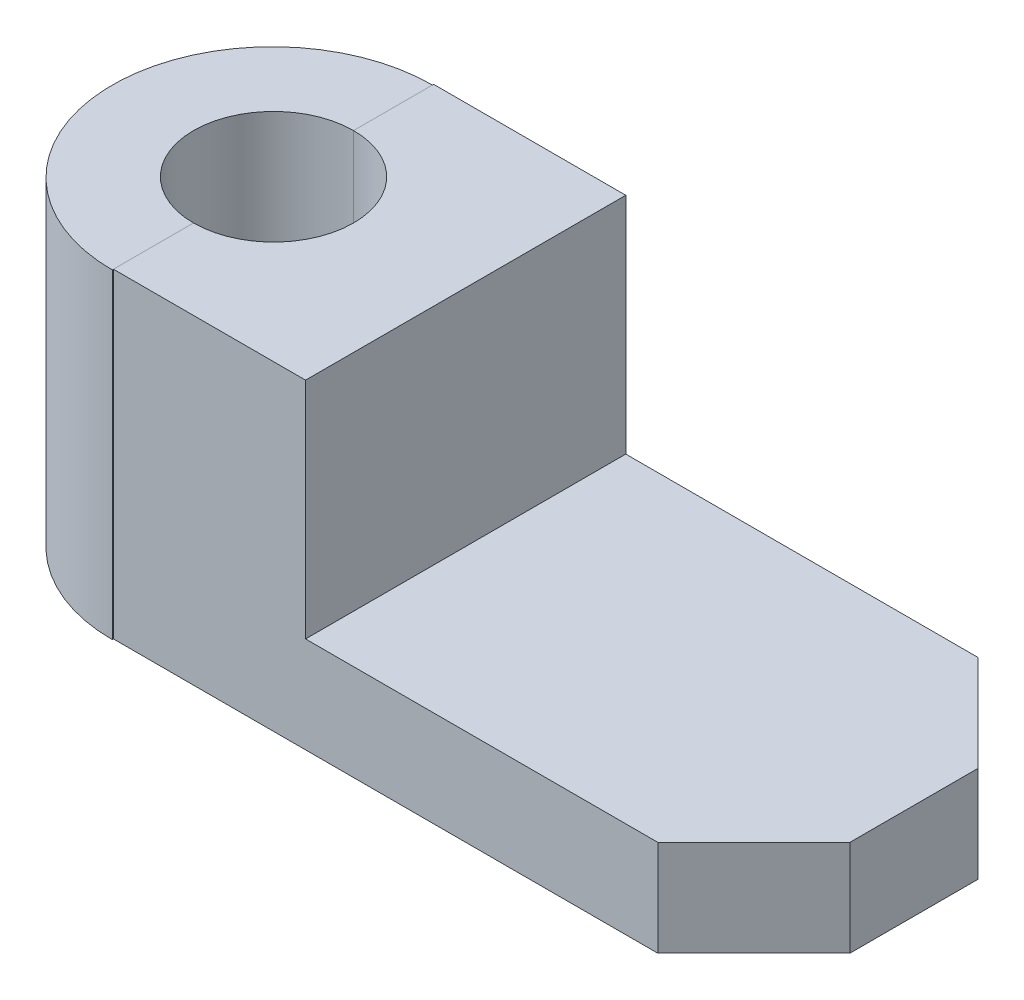
ISO-10303-21;
HEADER;
FILE_DESCRIPTION(('STEP AP214'),'2;1');
FILE_NAME('part.step','',(''),(''),'','','');
FILE_SCHEMA(('AUTOMOTIVE_DESIGN { 1 0 10303 214 1 1 1 1 }'));
ENDSEC;
DATA;
#1=APPLICATION_CONTEXT('core data for automotive mechanical design processes');
#2=APPLICATION_PROTOCOL_DEFINITION('international standard','automotive_design',2000,#1);
#3=PRODUCT_CONTEXT('',#1,'mechanical');
#4=PRODUCT('Part','Part','',(#3));
#5=PRODUCT_RELATED_PRODUCT_CATEGORY('part','',(#4));
#6=PRODUCT_DEFINITION_FORMATION('','',#4);
#7=PRODUCT_DEFINITION_CONTEXT('part definition',#1,'design');
#8=PRODUCT_DEFINITION('design','',#6,#7);
#9=PRODUCT_DEFINITION_SHAPE('','',#8);
#10=(LENGTH_UNIT() NAMED_UNIT(*) SI_UNIT(.MILLI.,.METRE.));
#11=(NAMED_UNIT(*) PLANE_ANGLE_UNIT() SI_UNIT($,.RADIAN.));
#12=(NAMED_UNIT(*) SI_UNIT($,.STERADIAN.) SOLID_ANGLE_UNIT());
#13=UNCERTAINTY_MEASURE_WITH_UNIT(LENGTH_MEASURE(1.E-05),#10,'distance_accuracy_value','');
#14=(GEOMETRIC_REPRESENTATION_CONTEXT(3) GLOBAL_UNCERTAINTY_ASSIGNED_CONTEXT((#13)) GLOBAL_UNIT_ASSIGNED_CONTEXT((#10,
#11,#12)) REPRESENTATION_CONTEXT('',''));
#15=CARTESIAN_POINT('',(0.,0.,0.));
#16=DIRECTION('',(0.,0.,1.));
#17=DIRECTION('',(1.,0.,0.));
#18=AXIS2_PLACEMENT_3D('',#15,#16,#17);
#19=CARTESIAN_POINT('',(-18.,0.,-14.8899054333838));
#20=DIRECTION('',(1.,0.,0.));
#21=DIRECTION('',(0.,0.,-1.));
#22=AXIS2_PLACEMENT_3D('',#19,#20,#21);
#23=PLANE('',#22);
#24=DIRECTION('',(0.,1.,0.));
#25=VECTOR('',#24,1.);
#26=CARTESIAN_POINT('',(-18.,0.,-7.5));
#27=LINE('',#26,#25);
#28=CARTESIAN_POINT('',(-18.,0.,-7.5));
#29=VERTEX_POINT('',#28);
#30=CARTESIAN_POINT('',(-18.,30.,-7.5));
#31=VERTEX_POINT('',#30);
#32=EDGE_CURVE('E71',#29,#31,#27,.T.);
#33=ORIENTED_EDGE('',*,*,#32,.F.);
#34=DIRECTION('',(0.,0.,-1.));
#35=VECTOR('',#34,1.);
#36=CARTESIAN_POINT('',(-18.,0.,-14.8899054333838));
#37=LINE('',#36,#35);
#38=CARTESIAN_POINT('',(-18.,0.,-14.8899054333838));
#39=VERTEX_POINT('',#38);
#40=EDGE_CURVE('E79',#29,#39,#37,.T.);
#41=ORIENTED_EDGE('',*,*,#40,.T.);
#42=DIRECTION('',(0.,1.,0.));
#43=VECTOR('',#42,1.);
#44=CARTESIAN_POINT('',(-18.,0.,-14.8899054333838));
#45=LINE('',#44,#43);
#46=CARTESIAN_POINT('',(-18.,30.,-14.8899054333838));
#47=VERTEX_POINT('',#46);
#48=EDGE_CURVE('E65',#39,#47,#45,.T.);
#49=ORIENTED_EDGE('',*,*,#48,.T.);
#50=DIRECTION('',(0.,0.,-1.));
#51=VECTOR('',#50,1.);
#52=CARTESIAN_POINT('',(-18.,30.,-14.8899054333838));
#53=LINE('',#52,#51);
#54=EDGE_CURVE('E93',#31,#47,#53,.T.);
#55=ORIENTED_EDGE('',*,*,#54,.F.);
#56=EDGE_LOOP('',(#33,#41,#49,#55));
#57=FACE_BOUND('',#56,.T.);
#58=ADVANCED_FACE('F57',(#57),#23,.T.);
#59=CARTESIAN_POINT('',(-18.,0.,0.110094566616196));
#60=DIRECTION('',(0.,1.,0.));
#61=DIRECTION('',(0.,0.,1.));
#62=AXIS2_PLACEMENT_3D('',#59,#60,#61);
#63=CYLINDRICAL_SURFACE('',#62,15.);
#64=CARTESIAN_POINT('',(-18.,30.,0.110094566616196));
#65=DIRECTION('',(0.,1.,0.));
#66=DIRECTION('',(0.,0.,1.));
#67=AXIS2_PLACEMENT_3D('',#64,#65,#66);
#68=CIRCLE('',#67,15.);
#69=CARTESIAN_POINT('',(-18.,30.,15.1100945666162));
#70=VERTEX_POINT('',#69);
#71=EDGE_CURVE('E97',#47,#70,#68,.T.);
#72=ORIENTED_EDGE('',*,*,#71,.F.);
#73=ORIENTED_EDGE('',*,*,#48,.F.);
#74=CARTESIAN_POINT('',(-18.,0.,0.110094566616196));
#75=DIRECTION('',(0.,1.,0.));
#76=DIRECTION('',(0.,0.,1.));
#77=AXIS2_PLACEMENT_3D('',#74,#75,#76);
#78=CIRCLE('',#77,15.);
#79=CARTESIAN_POINT('',(-18.,0.,15.1100945666162));
#80=VERTEX_POINT('',#79);
#81=EDGE_CURVE('E112',#39,#80,#78,.T.);
#82=ORIENTED_EDGE('',*,*,#81,.T.);
#83=DIRECTION('',(0.,1.,0.));
#84=VECTOR('',#83,1.);
#85=CARTESIAN_POINT('',(-18.,0.,15.1100945666162));
#86=LINE('',#85,#84);
#87=EDGE_CURVE('E104',#80,#70,#86,.T.);
#88=ORIENTED_EDGE('',*,*,#87,.T.);
#89=EDGE_LOOP('',(#72,#73,#82,#88));
#90=FACE_BOUND('',#89,.T.);
#91=ADVANCED_FACE('F59',(#90),#63,.T.);
#92=DIRECTION('',(0.,1.,0.));
#93=VECTOR('',#92,1.);
#94=CARTESIAN_POINT('',(-18.,0.,7.5));
#95=LINE('',#94,#93);
#96=CARTESIAN_POINT('',(-18.,30.,7.5));
#97=VERTEX_POINT('',#96);
#98=CARTESIAN_POINT('',(-18.,0.,7.5));
#99=VERTEX_POINT('',#98);
#100=EDGE_CURVE('E107',#97,#99,#95,.F.);
#101=ORIENTED_EDGE('',*,*,#100,.F.);
#102=EDGE_CURVE('E99',#70,#97,#53,.T.);
#103=ORIENTED_EDGE('',*,*,#102,.F.);
#104=ORIENTED_EDGE('',*,*,#87,.F.);
#105=EDGE_CURVE('E110',#80,#99,#37,.T.);
#106=ORIENTED_EDGE('',*,*,#105,.T.);
#107=EDGE_LOOP('',(#101,#103,#104,#106));
#108=FACE_BOUND('',#107,.T.);
#109=ADVANCED_FACE('F129',(#108),#23,.T.);
#110=CARTESIAN_POINT('',(-18.,0.,0.110094566616196));
#111=DIRECTION('',(0.,1.,0.));
#112=DIRECTION('',(0.,0.,1.));
#113=AXIS2_PLACEMENT_3D('',#110,#111,#112);
#114=PLANE('',#113);
#115=ORIENTED_EDGE('',*,*,#40,.F.);
#116=CARTESIAN_POINT('',(-18.,0.,0.));
#117=DIRECTION('',(0.,1.,0.));
#118=DIRECTION('',(0.,0.,1.));
#119=AXIS2_PLACEMENT_3D('',#116,#117,#118);
#120=CIRCLE('',#119,7.5);
#121=EDGE_CURVE('E121',#29,#99,#120,.T.);
#122=ORIENTED_EDGE('',*,*,#121,.T.);
#123=ORIENTED_EDGE('',*,*,#105,.F.);
#124=ORIENTED_EDGE('',*,*,#81,.F.);
#125=EDGE_LOOP('',(#115,#122,#123,#124));
#126=FACE_BOUND('',#125,.T.);
#127=ADVANCED_FACE('F124',(#126),#114,.F.);
#128=CARTESIAN_POINT('',(-18.,30.,0.110094566616196));
#129=DIRECTION('',(0.,1.,0.));
#130=DIRECTION('',(0.,0.,1.));
#131=AXIS2_PLACEMENT_3D('',#128,#129,#130);
#132=PLANE('',#131);
#133=CARTESIAN_POINT('',(-18.,30.,0.));
#134=DIRECTION('',(0.,1.,0.));
#135=DIRECTION('',(0.,0.,1.));
#136=AXIS2_PLACEMENT_3D('',#133,#134,#135);
#137=CIRCLE('',#136,7.5);
#138=EDGE_CURVE('E12',#31,#97,#137,.T.);
#139=ORIENTED_EDGE('',*,*,#138,.F.);
#140=ORIENTED_EDGE('',*,*,#54,.T.);
#141=ORIENTED_EDGE('',*,*,#71,.T.);
#142=ORIENTED_EDGE('',*,*,#102,.T.);
#143=EDGE_LOOP('',(#139,#140,#141,#142));
#144=FACE_BOUND('',#143,.T.);
#145=ADVANCED_FACE('F94',(#144),#132,.T.);
#146=CARTESIAN_POINT('',(-18.,0.,0.));
#147=DIRECTION('',(0.,1.,0.));
#148=DIRECTION('',(0.,0.,1.));
#149=AXIS2_PLACEMENT_3D('',#146,#147,#148);
#150=CYLINDRICAL_SURFACE('',#149,7.5);
#151=ORIENTED_EDGE('',*,*,#32,.T.);
#152=ORIENTED_EDGE('',*,*,#138,.T.);
#153=ORIENTED_EDGE('',*,*,#100,.T.);
#154=ORIENTED_EDGE('',*,*,#121,.F.);
#155=EDGE_LOOP('',(#151,#152,#153,#154));
#156=FACE_BOUND('',#155,.T.);
#157=ADVANCED_FACE('F127',(#156),#150,.F.);
#158=CLOSED_SHELL('',(#58,#91,#109,#127,#145,#157));
#159=MANIFOLD_SOLID_BREP('B2',#158);
#160=CARTESIAN_POINT('',(-18.,0.,15.));
#161=DIRECTION('',(1.,0.,0.));
#162=DIRECTION('',(0.,1.,0.));
#163=AXIS2_PLACEMENT_3D('',#160,#161,#162);
#164=PLANE('',#163);
#165=DIRECTION('',(0.,0.,-1.));
#166=VECTOR('',#165,1.);
#167=CARTESIAN_POINT('',(-18.,0.,15.));
#168=LINE('',#167,#166);
#169=CARTESIAN_POINT('',(-18.,0.,-7.5));
#170=VERTEX_POINT('',#169);
#171=CARTESIAN_POINT('',(-18.,0.,-15.));
#172=VERTEX_POINT('',#171);
#173=EDGE_CURVE('E281',#170,#172,#168,.T.);
#174=ORIENTED_EDGE('',*,*,#173,.F.);
#175=DIRECTION('',(0.,1.,0.));
#176=VECTOR('',#175,1.);
#177=CARTESIAN_POINT('',(-18.,0.,-7.5));
#178=LINE('',#177,#176);
#179=CARTESIAN_POINT('',(-18.,30.,-7.5));
#180=VERTEX_POINT('',#179);
#181=EDGE_CURVE('E258',#170,#180,#178,.T.);
#182=ORIENTED_EDGE('',*,*,#181,.T.);
#183=DIRECTION('',(0.,0.,-1.));
#184=VECTOR('',#183,1.);
#185=CARTESIAN_POINT('',(-18.,30.,15.));
#186=LINE('',#185,#184);
#187=CARTESIAN_POINT('',(-18.,30.,-15.));
#188=VERTEX_POINT('',#187);
#189=EDGE_CURVE('E343',#180,#188,#186,.T.);
#190=ORIENTED_EDGE('',*,*,#189,.T.);
#191=DIRECTION('',(0.,-1.,0.));
#192=VECTOR('',#191,1.);
#193=CARTESIAN_POINT('',(-18.,0.,-15.));
#194=LINE('',#193,#192);
#195=EDGE_CURVE('E366',#188,#172,#194,.T.);
#196=ORIENTED_EDGE('',*,*,#195,.T.);
#197=EDGE_LOOP('',(#174,#182,#190,#196));
#198=FACE_BOUND('',#197,.T.);
#199=ADVANCED_FACE('F178',(#198),#164,.F.);
#200=CARTESIAN_POINT('',(-18.,30.,15.));
#201=VERTEX_POINT('',#200);
#202=CARTESIAN_POINT('',(-18.,30.,7.5));
#203=VERTEX_POINT('',#202);
#204=EDGE_CURVE('E272',#201,#203,#186,.T.);
#205=ORIENTED_EDGE('',*,*,#204,.T.);
#206=DIRECTION('',(0.,1.,0.));
#207=VECTOR('',#206,1.);
#208=CARTESIAN_POINT('',(-18.,0.,7.5));
#209=LINE('',#208,#207);
#210=CARTESIAN_POINT('',(-18.,0.,7.5));
#211=VERTEX_POINT('',#210);
#212=EDGE_CURVE('E195',#203,#211,#209,.F.);
#213=ORIENTED_EDGE('',*,*,#212,.T.);
#214=CARTESIAN_POINT('',(-18.,0.,15.));
#215=VERTEX_POINT('',#214);
#216=EDGE_CURVE('E270',#215,#211,#168,.T.);
#217=ORIENTED_EDGE('',*,*,#216,.F.);
#218=DIRECTION('',(0.,-1.,0.));
#219=VECTOR('',#218,1.);
#220=CARTESIAN_POINT('',(-18.,0.,15.));
#221=LINE('',#220,#219);
#222=EDGE_CURVE('E355',#201,#215,#221,.T.);
#223=ORIENTED_EDGE('',*,*,#222,.F.);
#224=EDGE_LOOP('',(#205,#213,#217,#223));
#225=FACE_BOUND('',#224,.T.);
#226=ADVANCED_FACE('F268',(#225),#164,.F.);
#227=CARTESIAN_POINT('',(42.,0.,15.));
#228=DIRECTION('',(0.,1.,0.));
#229=DIRECTION('',(-1.,0.,0.));
#230=AXIS2_PLACEMENT_3D('',#227,#228,#229);
#231=PLANE('',#230);
#232=ORIENTED_EDGE('',*,*,#216,.T.);
#233=CARTESIAN_POINT('',(-18.,0.,0.));
#234=DIRECTION('',(0.,1.,0.));
#235=DIRECTION('',(0.,0.,1.));
#236=AXIS2_PLACEMENT_3D('',#233,#234,#235);
#237=CIRCLE('',#236,7.5);
#238=EDGE_CURVE('E255',#211,#170,#237,.T.);
#239=ORIENTED_EDGE('',*,*,#238,.T.);
#240=ORIENTED_EDGE('',*,*,#173,.T.);
#241=DIRECTION('',(1.,0.,0.));
#242=VECTOR('',#241,1.);
#243=CARTESIAN_POINT('',(0.,0.,-15.));
#244=LINE('',#243,#242);
#245=CARTESIAN_POINT('',(33.,0.,-15.));
#246=VERTEX_POINT('',#245);
#247=EDGE_CURVE('E323',#172,#246,#244,.T.);
#248=ORIENTED_EDGE('',*,*,#247,.T.);
#249=DIRECTION('',(0.707106781186549,0.,0.707106781186546));
#250=VECTOR('',#249,1.);
#251=CARTESIAN_POINT('',(42.,0.,-6.));
#252=LINE('',#251,#250);
#253=CARTESIAN_POINT('',(42.,0.,-6.));
#254=VERTEX_POINT('',#253);
#255=EDGE_CURVE('E55',#246,#254,#252,.T.);
#256=ORIENTED_EDGE('',*,*,#255,.T.);
#257=DIRECTION('',(0.,0.,-1.));
#258=VECTOR('',#257,1.);
#259=CARTESIAN_POINT('',(42.,0.,15.));
#260=LINE('',#259,#258);
#261=CARTESIAN_POINT('',(42.,0.,5.99999999999997));
#262=VERTEX_POINT('',#261);
#263=EDGE_CURVE('E288',#262,#254,#260,.T.);
#264=ORIENTED_EDGE('',*,*,#263,.F.);
#265=DIRECTION('',(0.707106781186546,0.,-0.707106781186549));
#266=VECTOR('',#265,1.);
#267=CARTESIAN_POINT('',(33.,0.,15.));
#268=LINE('',#267,#266);
#269=CARTESIAN_POINT('',(33.,0.,15.));
#270=VERTEX_POINT('',#269);
#271=EDGE_CURVE('E297',#262,#270,#268,.F.);
#272=ORIENTED_EDGE('',*,*,#271,.T.);
#273=DIRECTION('',(1.,0.,0.));
#274=VECTOR('',#273,1.);
#275=CARTESIAN_POINT('',(0.,0.,15.));
#276=LINE('',#275,#274);
#277=EDGE_CURVE('E277',#215,#270,#276,.T.);
#278=ORIENTED_EDGE('',*,*,#277,.F.);
#279=EDGE_LOOP('',(#232,#239,#240,#248,#256,#264,#272,#278));
#280=FACE_BOUND('',#279,.T.);
#281=ADVANCED_FACE('F275',(#280),#231,.F.);
#282=CARTESIAN_POINT('',(42.,9.,15.));
#283=DIRECTION('',(-1.,0.,0.));
#284=DIRECTION('',(0.,0.,1.));
#285=AXIS2_PLACEMENT_3D('',#282,#283,#284);
#286=PLANE('',#285);
#287=ORIENTED_EDGE('',*,*,#263,.T.);
#288=DIRECTION('',(0.,1.,0.));
#289=VECTOR('',#288,1.);
#290=CARTESIAN_POINT('',(42.,9.,-6.));
#291=LINE('',#290,#289);
#292=CARTESIAN_POINT('',(42.,9.,-6.));
#293=VERTEX_POINT('',#292);
#294=EDGE_CURVE('E300',#254,#293,#291,.T.);
#295=ORIENTED_EDGE('',*,*,#294,.T.);
#296=DIRECTION('',(0.,0.,-1.));
#297=VECTOR('',#296,1.);
#298=CARTESIAN_POINT('',(42.,9.,15.));
#299=LINE('',#298,#297);
#300=CARTESIAN_POINT('',(42.,9.,5.99999999999997));
#301=VERTEX_POINT('',#300);
#302=EDGE_CURVE('E314',#301,#293,#299,.T.);
#303=ORIENTED_EDGE('',*,*,#302,.F.);
#304=DIRECTION('',(0.,-1.,0.));
#305=VECTOR('',#304,1.);
#306=CARTESIAN_POINT('',(42.,9.,5.99999999999997));
#307=LINE('',#306,#305);
#308=EDGE_CURVE('E294',#301,#262,#307,.T.);
#309=ORIENTED_EDGE('',*,*,#308,.T.);
#310=EDGE_LOOP('',(#287,#295,#303,#309));
#311=FACE_BOUND('',#310,.T.);
#312=ADVANCED_FACE('F330',(#311),#286,.F.);
#313=CARTESIAN_POINT('',(0.,9.,15.));
#314=DIRECTION('',(0.,-1.,0.));
#315=DIRECTION('',(0.,0.,-1.));
#316=AXIS2_PLACEMENT_3D('',#313,#314,#315);
#317=PLANE('',#316);
#318=ORIENTED_EDGE('',*,*,#302,.T.);
#319=DIRECTION('',(-0.707106781186549,0.,-0.707106781186546));
#320=VECTOR('',#319,1.);
#321=CARTESIAN_POINT('',(42.,9.,-6.));
#322=LINE('',#321,#320);
#323=CARTESIAN_POINT('',(33.,9.,-15.));
#324=VERTEX_POINT('',#323);
#325=EDGE_CURVE('E304',#293,#324,#322,.T.);
#326=ORIENTED_EDGE('',*,*,#325,.T.);
#327=DIRECTION('',(-1.,0.,0.));
#328=VECTOR('',#327,1.);
#329=CARTESIAN_POINT('',(0.,9.,-15.));
#330=LINE('',#329,#328);
#331=CARTESIAN_POINT('',(0.,9.,-15.));
#332=VERTEX_POINT('',#331);
#333=EDGE_CURVE('E311',#324,#332,#330,.T.);
#334=ORIENTED_EDGE('',*,*,#333,.T.);
#335=DIRECTION('',(0.,0.,-1.));
#336=VECTOR('',#335,1.);
#337=CARTESIAN_POINT('',(0.,9.,15.));
#338=LINE('',#337,#336);
#339=CARTESIAN_POINT('',(0.,9.,15.));
#340=VERTEX_POINT('',#339);
#341=EDGE_CURVE('E334',#340,#332,#338,.T.);
#342=ORIENTED_EDGE('',*,*,#341,.F.);
#343=DIRECTION('',(-1.,0.,0.));
#344=VECTOR('',#343,1.);
#345=CARTESIAN_POINT('',(0.,9.,15.));
#346=LINE('',#345,#344);
#347=CARTESIAN_POINT('',(33.,9.,15.));
#348=VERTEX_POINT('',#347);
#349=EDGE_CURVE('E350',#348,#340,#346,.T.);
#350=ORIENTED_EDGE('',*,*,#349,.F.);
#351=DIRECTION('',(-0.707106781186546,0.,0.707106781186549));
#352=VECTOR('',#351,1.);
#353=CARTESIAN_POINT('',(33.,9.,15.));
#354=LINE('',#353,#352);
#355=EDGE_CURVE('E286',#348,#301,#354,.F.);
#356=ORIENTED_EDGE('',*,*,#355,.T.);
#357=EDGE_LOOP('',(#318,#326,#334,#342,#350,#356));
#358=FACE_BOUND('',#357,.T.);
#359=ADVANCED_FACE('F309',(#358),#317,.F.);
#360=CARTESIAN_POINT('',(0.,30.,15.));
#361=DIRECTION('',(-1.,0.,0.));
#362=DIRECTION('',(0.,-1.,0.));
#363=AXIS2_PLACEMENT_3D('',#360,#361,#362);
#364=PLANE('',#363);
#365=ORIENTED_EDGE('',*,*,#341,.T.);
#366=DIRECTION('',(0.,1.,0.));
#367=VECTOR('',#366,1.);
#368=CARTESIAN_POINT('',(0.,30.,-15.));
#369=LINE('',#368,#367);
#370=CARTESIAN_POINT('',(0.,30.,-15.));
#371=VERTEX_POINT('',#370);
#372=EDGE_CURVE('E321',#332,#371,#369,.T.);
#373=ORIENTED_EDGE('',*,*,#372,.T.);
#374=DIRECTION('',(0.,0.,-1.));
#375=VECTOR('',#374,1.);
#376=CARTESIAN_POINT('',(0.,30.,15.));
#377=LINE('',#376,#375);
#378=CARTESIAN_POINT('',(0.,30.,15.));
#379=VERTEX_POINT('',#378);
#380=EDGE_CURVE('E336',#379,#371,#377,.T.);
#381=ORIENTED_EDGE('',*,*,#380,.F.);
#382=DIRECTION('',(0.,1.,0.));
#383=VECTOR('',#382,1.);
#384=CARTESIAN_POINT('',(0.,30.,15.));
#385=LINE('',#384,#383);
#386=EDGE_CURVE('E347',#340,#379,#385,.T.);
#387=ORIENTED_EDGE('',*,*,#386,.F.);
#388=EDGE_LOOP('',(#365,#373,#381,#387));
#389=FACE_BOUND('',#388,.T.);
#390=ADVANCED_FACE('F383',(#389),#364,.F.);
#391=CARTESIAN_POINT('',(-18.,30.,15.));
#392=DIRECTION('',(0.,-1.,0.));
#393=DIRECTION('',(0.,0.,-1.));
#394=AXIS2_PLACEMENT_3D('',#391,#392,#393);
#395=PLANE('',#394);
#396=ORIENTED_EDGE('',*,*,#189,.F.);
#397=CARTESIAN_POINT('',(-18.,30.,0.));
#398=DIRECTION('',(0.,1.,0.));
#399=DIRECTION('',(0.,0.,1.));
#400=AXIS2_PLACEMENT_3D('',#397,#398,#399);
#401=CIRCLE('',#400,7.5);
#402=EDGE_CURVE('E263',#203,#180,#401,.T.);
#403=ORIENTED_EDGE('',*,*,#402,.F.);
#404=ORIENTED_EDGE('',*,*,#204,.F.);
#405=DIRECTION('',(-1.,0.,0.));
#406=VECTOR('',#405,1.);
#407=CARTESIAN_POINT('',(-18.,30.,15.));
#408=LINE('',#407,#406);
#409=EDGE_CURVE('E344',#379,#201,#408,.T.);
#410=ORIENTED_EDGE('',*,*,#409,.F.);
#411=ORIENTED_EDGE('',*,*,#380,.T.);
#412=DIRECTION('',(-1.,0.,0.));
#413=VECTOR('',#412,1.);
#414=CARTESIAN_POINT('',(-18.,30.,-15.));
#415=LINE('',#414,#413);
#416=EDGE_CURVE('E358',#371,#188,#415,.T.);
#417=ORIENTED_EDGE('',*,*,#416,.T.);
#418=EDGE_LOOP('',(#396,#403,#404,#410,#411,#417));
#419=FACE_BOUND('',#418,.T.);
#420=ADVANCED_FACE('F377',(#419),#395,.F.);
#421=CARTESIAN_POINT('',(0.,0.,15.));
#422=DIRECTION('',(0.,0.,-1.));
#423=DIRECTION('',(-1.,0.,0.));
#424=AXIS2_PLACEMENT_3D('',#421,#422,#423);
#425=PLANE('',#424);
#426=ORIENTED_EDGE('',*,*,#277,.T.);
#427=DIRECTION('',(0.,1.,0.));
#428=VECTOR('',#427,1.);
#429=CARTESIAN_POINT('',(33.,0.,15.));
#430=LINE('',#429,#428);
#431=EDGE_CURVE('E280',#270,#348,#430,.T.);
#432=ORIENTED_EDGE('',*,*,#431,.T.);
#433=ORIENTED_EDGE('',*,*,#349,.T.);
#434=ORIENTED_EDGE('',*,*,#386,.T.);
#435=ORIENTED_EDGE('',*,*,#409,.T.);
#436=ORIENTED_EDGE('',*,*,#222,.T.);
#437=EDGE_LOOP('',(#426,#432,#433,#434,#435,#436));
#438=FACE_BOUND('',#437,.T.);
#439=ADVANCED_FACE('F386',(#438),#425,.F.);
#440=CARTESIAN_POINT('',(0.,0.,-15.));
#441=DIRECTION('',(0.,0.,-1.));
#442=DIRECTION('',(-1.,0.,0.));
#443=AXIS2_PLACEMENT_3D('',#440,#441,#442);
#444=PLANE('',#443);
#445=ORIENTED_EDGE('',*,*,#333,.F.);
#446=DIRECTION('',(0.,-1.,0.));
#447=VECTOR('',#446,1.);
#448=CARTESIAN_POINT('',(33.,0.,-15.));
#449=LINE('',#448,#447);
#450=EDGE_CURVE('E188',#324,#246,#449,.T.);
#451=ORIENTED_EDGE('',*,*,#450,.T.);
#452=ORIENTED_EDGE('',*,*,#247,.F.);
#453=ORIENTED_EDGE('',*,*,#195,.F.);
#454=ORIENTED_EDGE('',*,*,#416,.F.);
#455=ORIENTED_EDGE('',*,*,#372,.F.);
#456=EDGE_LOOP('',(#445,#451,#452,#453,#454,#455));
#457=FACE_BOUND('',#456,.T.);
#458=ADVANCED_FACE('F318',(#457),#444,.T.);
#459=CARTESIAN_POINT('',(33.,0.,15.));
#460=DIRECTION('',(-0.707106781186549,0.,-0.707106781186546));
#461=DIRECTION('',(0.,1.,0.));
#462=AXIS2_PLACEMENT_3D('',#459,#460,#461);
#463=PLANE('',#462);
#464=ORIENTED_EDGE('',*,*,#271,.F.);
#465=ORIENTED_EDGE('',*,*,#308,.F.);
#466=ORIENTED_EDGE('',*,*,#355,.F.);
#467=ORIENTED_EDGE('',*,*,#431,.F.);
#468=EDGE_LOOP('',(#464,#465,#466,#467));
#469=FACE_BOUND('',#468,.T.);
#470=ADVANCED_FACE('F389',(#469),#463,.F.);
#471=CARTESIAN_POINT('',(42.,9.,-6.));
#472=DIRECTION('',(0.707106781186546,0.,-0.707106781186549));
#473=DIRECTION('',(0.,-1.,0.));
#474=AXIS2_PLACEMENT_3D('',#471,#472,#473);
#475=PLANE('',#474);
#476=ORIENTED_EDGE('',*,*,#255,.F.);
#477=ORIENTED_EDGE('',*,*,#450,.F.);
#478=ORIENTED_EDGE('',*,*,#325,.F.);
#479=ORIENTED_EDGE('',*,*,#294,.F.);
#480=EDGE_LOOP('',(#476,#477,#478,#479));
#481=FACE_BOUND('',#480,.T.);
#482=ADVANCED_FACE('F181',(#481),#475,.T.);
#483=CARTESIAN_POINT('',(-18.,0.,0.));
#484=DIRECTION('',(0.,1.,0.));
#485=DIRECTION('',(0.,0.,1.));
#486=AXIS2_PLACEMENT_3D('',#483,#484,#485);
#487=CYLINDRICAL_SURFACE('',#486,7.5);
#488=ORIENTED_EDGE('',*,*,#238,.F.);
#489=ORIENTED_EDGE('',*,*,#212,.F.);
#490=ORIENTED_EDGE('',*,*,#402,.T.);
#491=ORIENTED_EDGE('',*,*,#181,.F.);
#492=EDGE_LOOP('',(#488,#489,#490,#491));
#493=FACE_BOUND('',#492,.T.);
#494=ADVANCED_FACE('F256',(#493),#487,.F.);
#495=CLOSED_SHELL('',(#199,#226,#281,#312,#359,#390,#420,#439,#458,#470,#482,#494));
#496=MANIFOLD_SOLID_BREP('B6',#495);
#497=ADVANCED_BREP_SHAPE_REPRESENTATION('',(#18,#159,#496),#14);
#498=SHAPE_DEFINITION_REPRESENTATION(#9,#497);
ENDSEC;
END-ISO-10303-21;
